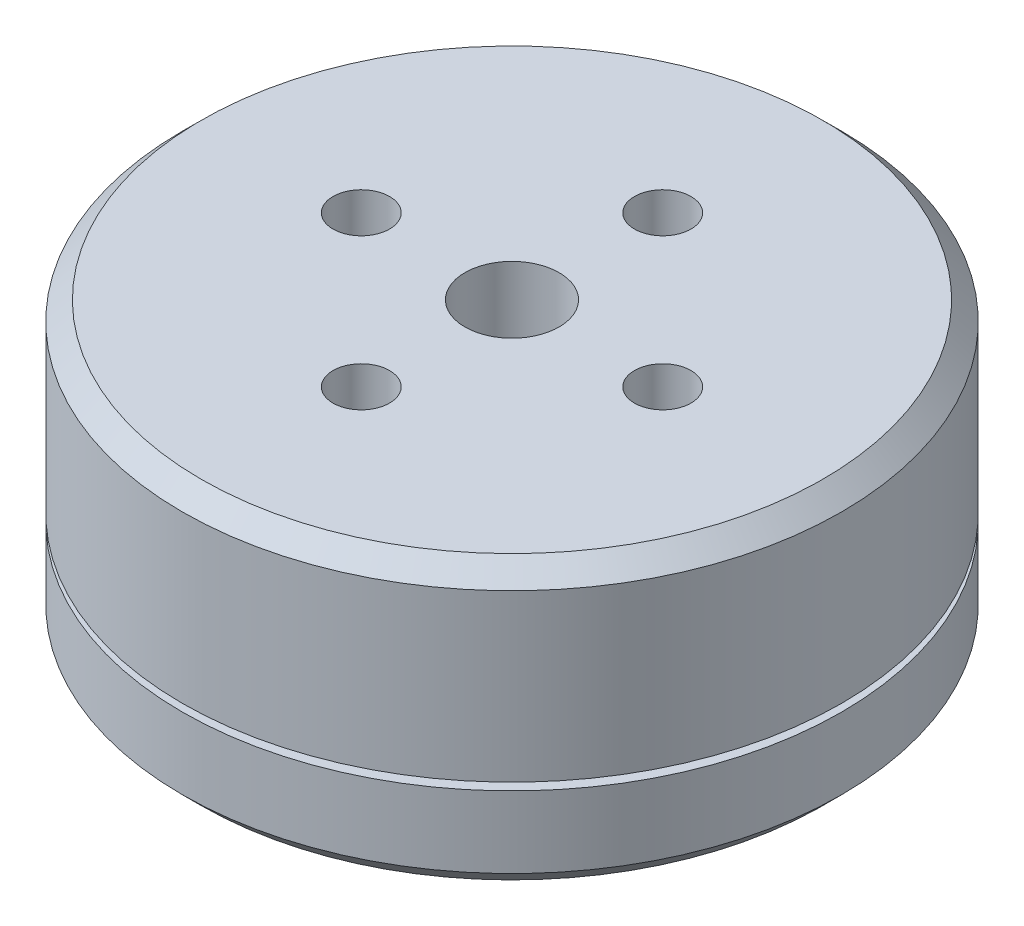
ISO-10303-21;
HEADER;
FILE_DESCRIPTION(('STEP AP214'),'2;1');
FILE_NAME('part.step','',(''),(''),'','','');
FILE_SCHEMA(('AUTOMOTIVE_DESIGN { 1 0 10303 214 1 1 1 1 }'));
ENDSEC;
DATA;
#1=APPLICATION_CONTEXT('core data for automotive mechanical design processes');
#2=APPLICATION_PROTOCOL_DEFINITION('international standard','automotive_design',2000,#1);
#3=PRODUCT_CONTEXT('',#1,'mechanical');
#4=PRODUCT('Part','Part','',(#3));
#5=PRODUCT_RELATED_PRODUCT_CATEGORY('part','',(#4));
#6=PRODUCT_DEFINITION_FORMATION('','',#4);
#7=PRODUCT_DEFINITION_CONTEXT('part definition',#1,'design');
#8=PRODUCT_DEFINITION('design','',#6,#7);
#9=PRODUCT_DEFINITION_SHAPE('','',#8);
#10=(LENGTH_UNIT() NAMED_UNIT(*) SI_UNIT(.MILLI.,.METRE.));
#11=(NAMED_UNIT(*) PLANE_ANGLE_UNIT() SI_UNIT($,.RADIAN.));
#12=(NAMED_UNIT(*) SI_UNIT($,.STERADIAN.) SOLID_ANGLE_UNIT());
#13=UNCERTAINTY_MEASURE_WITH_UNIT(LENGTH_MEASURE(1.E-05),#10,'distance_accuracy_value','');
#14=(GEOMETRIC_REPRESENTATION_CONTEXT(3) GLOBAL_UNCERTAINTY_ASSIGNED_CONTEXT((#13)) GLOBAL_UNIT_ASSIGNED_CONTEXT((#10,
#11,#12)) REPRESENTATION_CONTEXT('',''));
#15=CARTESIAN_POINT('',(0.,0.,0.));
#16=DIRECTION('',(0.,0.,1.));
#17=DIRECTION('',(1.,0.,0.));
#18=AXIS2_PLACEMENT_3D('',#15,#16,#17);
#19=CARTESIAN_POINT('',(0.,15.,0.));
#20=DIRECTION('',(0.,-1.,0.));
#21=DIRECTION('',(0.,0.,-1.));
#22=AXIS2_PLACEMENT_3D('',#19,#20,#21);
#23=CYLINDRICAL_SURFACE('',#22,17.5);
#24=CARTESIAN_POINT('',(0.,1.00000000000001,0.));
#25=DIRECTION('',(0.,1.,0.));
#26=DIRECTION('',(0.,0.,1.));
#27=AXIS2_PLACEMENT_3D('',#24,#25,#26);
#28=CIRCLE('',#27,17.5);
#29=CARTESIAN_POINT('',(0.,1.00000000000001,17.5));
#30=VERTEX_POINT('',#29);
#31=EDGE_CURVE('E61',#30,#30,#28,.T.);
#32=ORIENTED_EDGE('',*,*,#31,.T.);
#33=EDGE_LOOP('',(#32));
#34=FACE_BOUND('',#33,.T.);
#35=CARTESIAN_POINT('',(0.,4.8,0.));
#36=DIRECTION('',(0.,-1.,0.));
#37=DIRECTION('',(0.,0.,-1.));
#38=AXIS2_PLACEMENT_3D('',#35,#36,#37);
#39=CIRCLE('',#38,17.5);
#40=CARTESIAN_POINT('',(0.,4.8,-17.5));
#41=VERTEX_POINT('',#40);
#42=EDGE_CURVE('E105',#41,#41,#39,.T.);
#43=ORIENTED_EDGE('',*,*,#42,.T.);
#44=EDGE_LOOP('',(#43));
#45=FACE_BOUND('',#44,.T.);
#46=ADVANCED_FACE('F42',(#34,#45),#23,.T.);
#47=CARTESIAN_POINT('',(0.,0.,0.));
#48=DIRECTION('',(0.,1.,0.));
#49=DIRECTION('',(0.,0.,1.));
#50=AXIS2_PLACEMENT_3D('',#47,#48,#49);
#51=PLANE('',#50);
#52=CARTESIAN_POINT('',(0.,0.,0.));
#53=DIRECTION('',(0.,1.,0.));
#54=DIRECTION('',(0.,0.,1.));
#55=AXIS2_PLACEMENT_3D('',#52,#53,#54);
#56=CIRCLE('',#55,2.5);
#57=CARTESIAN_POINT('',(0.,0.,2.5));
#58=VERTEX_POINT('',#57);
#59=EDGE_CURVE('E147',#58,#58,#56,.T.);
#60=ORIENTED_EDGE('',*,*,#59,.T.);
#61=EDGE_LOOP('',(#60));
#62=FACE_BOUND('',#61,.T.);
#63=CARTESIAN_POINT('',(0.,0.,0.));
#64=DIRECTION('',(0.,1.,0.));
#65=DIRECTION('',(0.,0.,1.));
#66=AXIS2_PLACEMENT_3D('',#63,#64,#65);
#67=CIRCLE('',#66,16.5);
#68=CARTESIAN_POINT('',(0.,0.,16.5));
#69=VERTEX_POINT('',#68);
#70=EDGE_CURVE('E56',#69,#69,#67,.F.);
#71=ORIENTED_EDGE('',*,*,#70,.T.);
#72=EDGE_LOOP('',(#71));
#73=FACE_BOUND('',#72,.T.);
#74=CARTESIAN_POINT('',(0.,0.,9.5));
#75=DIRECTION('',(0.,-1.,0.));
#76=DIRECTION('',(0.,0.,-1.));
#77=AXIS2_PLACEMENT_3D('',#74,#75,#76);
#78=CIRCLE('',#77,1.5);
#79=CARTESIAN_POINT('',(0.,0.,8.));
#80=VERTEX_POINT('',#79);
#81=EDGE_CURVE('E125',#80,#80,#78,.T.);
#82=ORIENTED_EDGE('',*,*,#81,.F.);
#83=EDGE_LOOP('',(#82));
#84=FACE_BOUND('',#83,.T.);
#85=CARTESIAN_POINT('',(0.,0.,-9.5));
#86=DIRECTION('',(0.,-1.,0.));
#87=DIRECTION('',(0.,0.,-1.));
#88=AXIS2_PLACEMENT_3D('',#85,#86,#87);
#89=CIRCLE('',#88,1.5);
#90=CARTESIAN_POINT('',(0.,0.,-11.));
#91=VERTEX_POINT('',#90);
#92=EDGE_CURVE('E121',#91,#91,#89,.T.);
#93=ORIENTED_EDGE('',*,*,#92,.F.);
#94=EDGE_LOOP('',(#93));
#95=FACE_BOUND('',#94,.T.);
#96=CARTESIAN_POINT('',(8.,0.,0.));
#97=DIRECTION('',(0.,-1.,0.));
#98=DIRECTION('',(0.,0.,-1.));
#99=AXIS2_PLACEMENT_3D('',#96,#97,#98);
#100=CIRCLE('',#99,1.5);
#101=CARTESIAN_POINT('',(8.,0.,-1.5));
#102=VERTEX_POINT('',#101);
#103=EDGE_CURVE('E113',#102,#102,#100,.T.);
#104=ORIENTED_EDGE('',*,*,#103,.F.);
#105=EDGE_LOOP('',(#104));
#106=FACE_BOUND('',#105,.T.);
#107=CARTESIAN_POINT('',(-8.,0.,0.));
#108=DIRECTION('',(0.,-1.,0.));
#109=DIRECTION('',(0.,0.,-1.));
#110=AXIS2_PLACEMENT_3D('',#107,#108,#109);
#111=CIRCLE('',#110,1.5);
#112=CARTESIAN_POINT('',(-8.,0.,-1.5));
#113=VERTEX_POINT('',#112);
#114=EDGE_CURVE('E104',#113,#113,#111,.T.);
#115=ORIENTED_EDGE('',*,*,#114,.F.);
#116=EDGE_LOOP('',(#115));
#117=FACE_BOUND('',#116,.T.);
#118=ADVANCED_FACE('F156',(#62,#73,#84,#95,#106,#117),#51,.F.);
#119=CARTESIAN_POINT('',(-8.,3.,0.));
#120=DIRECTION('',(0.,-1.,0.));
#121=DIRECTION('',(0.,0.,-1.));
#122=AXIS2_PLACEMENT_3D('',#119,#120,#121);
#123=CYLINDRICAL_SURFACE('',#122,1.5);
#124=CARTESIAN_POINT('',(-8.,3.,0.));
#125=DIRECTION('',(0.,-1.,0.));
#126=DIRECTION('',(0.,0.,-1.));
#127=AXIS2_PLACEMENT_3D('',#124,#125,#126);
#128=CIRCLE('',#127,1.5);
#129=CARTESIAN_POINT('',(-8.,3.,-1.5));
#130=VERTEX_POINT('',#129);
#131=EDGE_CURVE('E100',#130,#130,#128,.T.);
#132=ORIENTED_EDGE('',*,*,#131,.F.);
#133=EDGE_LOOP('',(#132));
#134=FACE_BOUND('',#133,.T.);
#135=ORIENTED_EDGE('',*,*,#114,.T.);
#136=EDGE_LOOP('',(#135));
#137=FACE_BOUND('',#136,.T.);
#138=ADVANCED_FACE('F205',(#134,#137),#123,.F.);
#139=CARTESIAN_POINT('',(-8.,3.,0.));
#140=DIRECTION('',(0.,-1.,0.));
#141=DIRECTION('',(0.,0.,-1.));
#142=AXIS2_PLACEMENT_3D('',#139,#140,#141);
#143=PLANE('',#142);
#144=ORIENTED_EDGE('',*,*,#131,.T.);
#145=EDGE_LOOP('',(#144));
#146=FACE_BOUND('',#145,.T.);
#147=ADVANCED_FACE('F258',(#146),#143,.T.);
#148=CARTESIAN_POINT('',(8.,3.,0.));
#149=DIRECTION('',(0.,-1.,0.));
#150=DIRECTION('',(0.,0.,-1.));
#151=AXIS2_PLACEMENT_3D('',#148,#149,#150);
#152=CYLINDRICAL_SURFACE('',#151,1.5);
#153=CARTESIAN_POINT('',(8.,3.,0.));
#154=DIRECTION('',(0.,-1.,0.));
#155=DIRECTION('',(0.,0.,-1.));
#156=AXIS2_PLACEMENT_3D('',#153,#154,#155);
#157=CIRCLE('',#156,1.5);
#158=CARTESIAN_POINT('',(8.,3.,-1.5));
#159=VERTEX_POINT('',#158);
#160=EDGE_CURVE('E109',#159,#159,#157,.T.);
#161=ORIENTED_EDGE('',*,*,#160,.F.);
#162=EDGE_LOOP('',(#161));
#163=FACE_BOUND('',#162,.T.);
#164=ORIENTED_EDGE('',*,*,#103,.T.);
#165=EDGE_LOOP('',(#164));
#166=FACE_BOUND('',#165,.T.);
#167=ADVANCED_FACE('F255',(#163,#166),#152,.F.);
#168=CARTESIAN_POINT('',(8.,3.,0.));
#169=DIRECTION('',(0.,-1.,0.));
#170=DIRECTION('',(0.,0.,-1.));
#171=AXIS2_PLACEMENT_3D('',#168,#169,#170);
#172=PLANE('',#171);
#173=ORIENTED_EDGE('',*,*,#160,.T.);
#174=EDGE_LOOP('',(#173));
#175=FACE_BOUND('',#174,.T.);
#176=ADVANCED_FACE('F250',(#175),#172,.T.);
#177=CARTESIAN_POINT('',(0.,3.,-9.5));
#178=DIRECTION('',(0.,-1.,0.));
#179=DIRECTION('',(0.,0.,-1.));
#180=AXIS2_PLACEMENT_3D('',#177,#178,#179);
#181=CYLINDRICAL_SURFACE('',#180,1.5);
#182=CARTESIAN_POINT('',(0.,3.,-9.5));
#183=DIRECTION('',(0.,-1.,0.));
#184=DIRECTION('',(0.,0.,-1.));
#185=AXIS2_PLACEMENT_3D('',#182,#183,#184);
#186=CIRCLE('',#185,1.5);
#187=CARTESIAN_POINT('',(0.,3.,-11.));
#188=VERTEX_POINT('',#187);
#189=EDGE_CURVE('E117',#188,#188,#186,.T.);
#190=ORIENTED_EDGE('',*,*,#189,.F.);
#191=EDGE_LOOP('',(#190));
#192=FACE_BOUND('',#191,.T.);
#193=ORIENTED_EDGE('',*,*,#92,.T.);
#194=EDGE_LOOP('',(#193));
#195=FACE_BOUND('',#194,.T.);
#196=ADVANCED_FACE('F247',(#192,#195),#181,.F.);
#197=CARTESIAN_POINT('',(0.,3.,-9.5));
#198=DIRECTION('',(0.,-1.,0.));
#199=DIRECTION('',(0.,0.,-1.));
#200=AXIS2_PLACEMENT_3D('',#197,#198,#199);
#201=PLANE('',#200);
#202=ORIENTED_EDGE('',*,*,#189,.T.);
#203=EDGE_LOOP('',(#202));
#204=FACE_BOUND('',#203,.T.);
#205=ADVANCED_FACE('F245',(#204),#201,.T.);
#206=CARTESIAN_POINT('',(0.,3.,9.5));
#207=DIRECTION('',(0.,-1.,0.));
#208=DIRECTION('',(0.,0.,-1.));
#209=AXIS2_PLACEMENT_3D('',#206,#207,#208);
#210=CYLINDRICAL_SURFACE('',#209,1.5);
#211=CARTESIAN_POINT('',(0.,3.,9.5));
#212=DIRECTION('',(0.,-1.,0.));
#213=DIRECTION('',(0.,0.,-1.));
#214=AXIS2_PLACEMENT_3D('',#211,#212,#213);
#215=CIRCLE('',#214,1.5);
#216=CARTESIAN_POINT('',(0.,3.,8.));
#217=VERTEX_POINT('',#216);
#218=EDGE_CURVE('E73',#217,#217,#215,.T.);
#219=ORIENTED_EDGE('',*,*,#218,.F.);
#220=EDGE_LOOP('',(#219));
#221=FACE_BOUND('',#220,.T.);
#222=ORIENTED_EDGE('',*,*,#81,.T.);
#223=EDGE_LOOP('',(#222));
#224=FACE_BOUND('',#223,.T.);
#225=ADVANCED_FACE('F241',(#221,#224),#210,.F.);
#226=CARTESIAN_POINT('',(0.,3.,9.5));
#227=DIRECTION('',(0.,-1.,0.));
#228=DIRECTION('',(0.,0.,-1.));
#229=AXIS2_PLACEMENT_3D('',#226,#227,#228);
#230=PLANE('',#229);
#231=ORIENTED_EDGE('',*,*,#218,.T.);
#232=EDGE_LOOP('',(#231));
#233=FACE_BOUND('',#232,.T.);
#234=ADVANCED_FACE('F237',(#233),#230,.T.);
#235=CARTESIAN_POINT('',(0.,4.8,0.));
#236=DIRECTION('',(0.,-1.,0.));
#237=DIRECTION('',(0.,0.,-1.));
#238=AXIS2_PLACEMENT_3D('',#235,#236,#237);
#239=PLANE('',#238);
#240=ORIENTED_EDGE('',*,*,#42,.F.);
#241=EDGE_LOOP('',(#240));
#242=FACE_BOUND('',#241,.T.);
#243=CARTESIAN_POINT('',(0.,4.8,0.));
#244=DIRECTION('',(0.,-1.,0.));
#245=DIRECTION('',(0.,0.,-1.));
#246=AXIS2_PLACEMENT_3D('',#243,#244,#245);
#247=CIRCLE('',#246,16.5);
#248=CARTESIAN_POINT('',(0.,4.8,-16.5));
#249=VERTEX_POINT('',#248);
#250=EDGE_CURVE('E135',#249,#249,#247,.T.);
#251=ORIENTED_EDGE('',*,*,#250,.T.);
#252=EDGE_LOOP('',(#251));
#253=FACE_BOUND('',#252,.T.);
#254=ADVANCED_FACE('F230',(#242,#253),#239,.F.);
#255=CARTESIAN_POINT('',(0.,4.8,0.));
#256=DIRECTION('',(0.,1.,0.));
#257=DIRECTION('',(0.,0.,1.));
#258=AXIS2_PLACEMENT_3D('',#255,#256,#257);
#259=CYLINDRICAL_SURFACE('',#258,16.5);
#260=ORIENTED_EDGE('',*,*,#250,.F.);
#261=EDGE_LOOP('',(#260));
#262=FACE_BOUND('',#261,.T.);
#263=CARTESIAN_POINT('',(0.,5.2,0.));
#264=DIRECTION('',(0.,-1.,0.));
#265=DIRECTION('',(0.,0.,-1.));
#266=AXIS2_PLACEMENT_3D('',#263,#264,#265);
#267=CIRCLE('',#266,16.5);
#268=CARTESIAN_POINT('',(0.,5.2,-16.5));
#269=VERTEX_POINT('',#268);
#270=EDGE_CURVE('E143',#269,#269,#267,.T.);
#271=ORIENTED_EDGE('',*,*,#270,.T.);
#272=EDGE_LOOP('',(#271));
#273=FACE_BOUND('',#272,.T.);
#274=ADVANCED_FACE('F221',(#262,#273),#259,.T.);
#275=CARTESIAN_POINT('',(0.,5.2,0.));
#276=DIRECTION('',(0.,-1.,0.));
#277=DIRECTION('',(0.,0.,-1.));
#278=AXIS2_PLACEMENT_3D('',#275,#276,#277);
#279=PLANE('',#278);
#280=ORIENTED_EDGE('',*,*,#270,.F.);
#281=EDGE_LOOP('',(#280));
#282=FACE_BOUND('',#281,.T.);
#283=CARTESIAN_POINT('',(0.,5.2,0.));
#284=DIRECTION('',(0.,-1.,0.));
#285=DIRECTION('',(0.,0.,-1.));
#286=AXIS2_PLACEMENT_3D('',#283,#284,#285);
#287=CIRCLE('',#286,17.5);
#288=CARTESIAN_POINT('',(0.,5.2,-17.5));
#289=VERTEX_POINT('',#288);
#290=EDGE_CURVE('E139',#289,#289,#287,.T.);
#291=ORIENTED_EDGE('',*,*,#290,.T.);
#292=EDGE_LOOP('',(#291));
#293=FACE_BOUND('',#292,.T.);
#294=ADVANCED_FACE('F218',(#282,#293),#279,.T.);
#295=CARTESIAN_POINT('',(0.,12.,8.));
#296=DIRECTION('',(0.,1.,0.));
#297=DIRECTION('',(0.,0.,1.));
#298=AXIS2_PLACEMENT_3D('',#295,#296,#297);
#299=PLANE('',#298);
#300=CARTESIAN_POINT('',(0.,12.,8.));
#301=DIRECTION('',(0.,1.,0.));
#302=DIRECTION('',(0.,0.,1.));
#303=AXIS2_PLACEMENT_3D('',#300,#301,#302);
#304=CIRCLE('',#303,1.5);
#305=CARTESIAN_POINT('',(0.,12.,9.5));
#306=VERTEX_POINT('',#305);
#307=EDGE_CURVE('E68',#306,#306,#304,.T.);
#308=ORIENTED_EDGE('',*,*,#307,.T.);
#309=EDGE_LOOP('',(#308));
#310=FACE_BOUND('',#309,.T.);
#311=ADVANCED_FACE('F220',(#310),#299,.T.);
#312=CARTESIAN_POINT('',(0.,12.,-8.));
#313=DIRECTION('',(0.,1.,0.));
#314=DIRECTION('',(0.,0.,1.));
#315=AXIS2_PLACEMENT_3D('',#312,#313,#314);
#316=PLANE('',#315);
#317=CARTESIAN_POINT('',(0.,12.,-8.));
#318=DIRECTION('',(0.,1.,0.));
#319=DIRECTION('',(0.,0.,1.));
#320=AXIS2_PLACEMENT_3D('',#317,#318,#319);
#321=CIRCLE('',#320,1.5);
#322=CARTESIAN_POINT('',(0.,12.,-6.5));
#323=VERTEX_POINT('',#322);
#324=EDGE_CURVE('E77',#323,#323,#321,.T.);
#325=ORIENTED_EDGE('',*,*,#324,.T.);
#326=EDGE_LOOP('',(#325));
#327=FACE_BOUND('',#326,.T.);
#328=ADVANCED_FACE('F228',(#327),#316,.T.);
#329=CARTESIAN_POINT('',(8.,12.,0.));
#330=DIRECTION('',(0.,1.,0.));
#331=DIRECTION('',(0.,0.,1.));
#332=AXIS2_PLACEMENT_3D('',#329,#330,#331);
#333=PLANE('',#332);
#334=CARTESIAN_POINT('',(8.,12.,0.));
#335=DIRECTION('',(0.,1.,0.));
#336=DIRECTION('',(0.,0.,1.));
#337=AXIS2_PLACEMENT_3D('',#334,#335,#336);
#338=CIRCLE('',#337,1.5);
#339=CARTESIAN_POINT('',(8.,12.,1.5));
#340=VERTEX_POINT('',#339);
#341=EDGE_CURVE('E85',#340,#340,#338,.T.);
#342=ORIENTED_EDGE('',*,*,#341,.T.);
#343=EDGE_LOOP('',(#342));
#344=FACE_BOUND('',#343,.T.);
#345=ADVANCED_FACE('F192',(#344),#333,.T.);
#346=CARTESIAN_POINT('',(-8.,12.,0.));
#347=DIRECTION('',(0.,1.,0.));
#348=DIRECTION('',(0.,0.,1.));
#349=AXIS2_PLACEMENT_3D('',#346,#347,#348);
#350=PLANE('',#349);
#351=CARTESIAN_POINT('',(-8.,12.,0.));
#352=DIRECTION('',(0.,1.,0.));
#353=DIRECTION('',(0.,0.,1.));
#354=AXIS2_PLACEMENT_3D('',#351,#352,#353);
#355=CIRCLE('',#354,1.5);
#356=CARTESIAN_POINT('',(-8.,12.,1.5));
#357=VERTEX_POINT('',#356);
#358=EDGE_CURVE('E67',#357,#357,#355,.T.);
#359=ORIENTED_EDGE('',*,*,#358,.T.);
#360=EDGE_LOOP('',(#359));
#361=FACE_BOUND('',#360,.T.);
#362=ADVANCED_FACE('F182',(#361),#350,.T.);
#363=CARTESIAN_POINT('',(0.,12.,8.));
#364=DIRECTION('',(0.,1.,0.));
#365=DIRECTION('',(0.,0.,1.));
#366=AXIS2_PLACEMENT_3D('',#363,#364,#365);
#367=CYLINDRICAL_SURFACE('',#366,1.5);
#368=ORIENTED_EDGE('',*,*,#307,.F.);
#369=EDGE_LOOP('',(#368));
#370=FACE_BOUND('',#369,.T.);
#371=CARTESIAN_POINT('',(0.,15.,8.));
#372=DIRECTION('',(0.,1.,0.));
#373=DIRECTION('',(0.,0.,1.));
#374=AXIS2_PLACEMENT_3D('',#371,#372,#373);
#375=CIRCLE('',#374,1.5);
#376=CARTESIAN_POINT('',(0.,15.,9.5));
#377=VERTEX_POINT('',#376);
#378=EDGE_CURVE('E72',#377,#377,#375,.T.);
#379=ORIENTED_EDGE('',*,*,#378,.T.);
#380=EDGE_LOOP('',(#379));
#381=FACE_BOUND('',#380,.T.);
#382=ADVANCED_FACE('F179',(#370,#381),#367,.F.);
#383=CARTESIAN_POINT('',(0.,12.,-8.));
#384=DIRECTION('',(0.,1.,0.));
#385=DIRECTION('',(0.,0.,1.));
#386=AXIS2_PLACEMENT_3D('',#383,#384,#385);
#387=CYLINDRICAL_SURFACE('',#386,1.5);
#388=ORIENTED_EDGE('',*,*,#324,.F.);
#389=EDGE_LOOP('',(#388));
#390=FACE_BOUND('',#389,.T.);
#391=CARTESIAN_POINT('',(0.,15.,-8.));
#392=DIRECTION('',(0.,1.,0.));
#393=DIRECTION('',(0.,0.,1.));
#394=AXIS2_PLACEMENT_3D('',#391,#392,#393);
#395=CIRCLE('',#394,1.5);
#396=CARTESIAN_POINT('',(0.,15.,-6.5));
#397=VERTEX_POINT('',#396);
#398=EDGE_CURVE('E81',#397,#397,#395,.T.);
#399=ORIENTED_EDGE('',*,*,#398,.T.);
#400=EDGE_LOOP('',(#399));
#401=FACE_BOUND('',#400,.T.);
#402=ADVANCED_FACE('F181',(#390,#401),#387,.F.);
#403=CARTESIAN_POINT('',(8.,12.,0.));
#404=DIRECTION('',(0.,1.,0.));
#405=DIRECTION('',(0.,0.,1.));
#406=AXIS2_PLACEMENT_3D('',#403,#404,#405);
#407=CYLINDRICAL_SURFACE('',#406,1.5);
#408=ORIENTED_EDGE('',*,*,#341,.F.);
#409=EDGE_LOOP('',(#408));
#410=FACE_BOUND('',#409,.T.);
#411=CARTESIAN_POINT('',(8.,15.,0.));
#412=DIRECTION('',(0.,1.,0.));
#413=DIRECTION('',(0.,0.,1.));
#414=AXIS2_PLACEMENT_3D('',#411,#412,#413);
#415=CIRCLE('',#414,1.5);
#416=CARTESIAN_POINT('',(8.,15.,1.5));
#417=VERTEX_POINT('',#416);
#418=EDGE_CURVE('E89',#417,#417,#415,.T.);
#419=ORIENTED_EDGE('',*,*,#418,.T.);
#420=EDGE_LOOP('',(#419));
#421=FACE_BOUND('',#420,.T.);
#422=ADVANCED_FACE('F189',(#410,#421),#407,.F.);
#423=CARTESIAN_POINT('',(-8.,12.,0.));
#424=DIRECTION('',(0.,1.,0.));
#425=DIRECTION('',(0.,0.,1.));
#426=AXIS2_PLACEMENT_3D('',#423,#424,#425);
#427=CYLINDRICAL_SURFACE('',#426,1.5);
#428=ORIENTED_EDGE('',*,*,#358,.F.);
#429=EDGE_LOOP('',(#428));
#430=FACE_BOUND('',#429,.T.);
#431=CARTESIAN_POINT('',(-8.,15.,0.));
#432=DIRECTION('',(0.,1.,0.));
#433=DIRECTION('',(0.,0.,1.));
#434=AXIS2_PLACEMENT_3D('',#431,#432,#433);
#435=CIRCLE('',#434,1.5);
#436=CARTESIAN_POINT('',(-8.,15.,1.5));
#437=VERTEX_POINT('',#436);
#438=EDGE_CURVE('E93',#437,#437,#435,.T.);
#439=ORIENTED_EDGE('',*,*,#438,.T.);
#440=EDGE_LOOP('',(#439));
#441=FACE_BOUND('',#440,.T.);
#442=ADVANCED_FACE('F168',(#430,#441),#427,.F.);
#443=CARTESIAN_POINT('',(0.,15.,0.));
#444=DIRECTION('',(0.,1.,0.));
#445=DIRECTION('',(0.,0.,1.));
#446=AXIS2_PLACEMENT_3D('',#443,#444,#445);
#447=PLANE('',#446);
#448=CARTESIAN_POINT('',(0.,15.,0.));
#449=DIRECTION('',(0.,1.,0.));
#450=DIRECTION('',(0.,0.,1.));
#451=AXIS2_PLACEMENT_3D('',#448,#449,#450);
#452=CIRCLE('',#451,2.5);
#453=CARTESIAN_POINT('',(0.,15.,2.5));
#454=VERTEX_POINT('',#453);
#455=EDGE_CURVE('E148',#454,#454,#452,.T.);
#456=ORIENTED_EDGE('',*,*,#455,.F.);
#457=EDGE_LOOP('',(#456));
#458=FACE_BOUND('',#457,.T.);
#459=CARTESIAN_POINT('',(0.,15.,0.));
#460=DIRECTION('',(0.,1.,0.));
#461=DIRECTION('',(0.,0.,1.));
#462=AXIS2_PLACEMENT_3D('',#459,#460,#461);
#463=CIRCLE('',#462,16.5);
#464=CARTESIAN_POINT('',(0.,15.,16.5));
#465=VERTEX_POINT('',#464);
#466=EDGE_CURVE('E51',#465,#465,#463,.T.);
#467=ORIENTED_EDGE('',*,*,#466,.T.);
#468=EDGE_LOOP('',(#467));
#469=FACE_BOUND('',#468,.T.);
#470=ORIENTED_EDGE('',*,*,#438,.F.);
#471=EDGE_LOOP('',(#470));
#472=FACE_BOUND('',#471,.T.);
#473=ORIENTED_EDGE('',*,*,#418,.F.);
#474=EDGE_LOOP('',(#473));
#475=FACE_BOUND('',#474,.T.);
#476=ORIENTED_EDGE('',*,*,#398,.F.);
#477=EDGE_LOOP('',(#476));
#478=FACE_BOUND('',#477,.T.);
#479=ORIENTED_EDGE('',*,*,#378,.F.);
#480=EDGE_LOOP('',(#479));
#481=FACE_BOUND('',#480,.T.);
#482=ADVANCED_FACE('F165',(#458,#469,#472,#475,#478,#481),#447,.T.);
#483=CARTESIAN_POINT('',(0.,14.,0.));
#484=DIRECTION('',(0.,1.,0.));
#485=DIRECTION('',(0.,0.,1.));
#486=AXIS2_PLACEMENT_3D('',#483,#484,#485);
#487=CIRCLE('',#486,17.5);
#488=CARTESIAN_POINT('',(0.,14.,17.5));
#489=VERTEX_POINT('',#488);
#490=EDGE_CURVE('E10',#489,#489,#487,.F.);
#491=ORIENTED_EDGE('',*,*,#490,.T.);
#492=EDGE_LOOP('',(#491));
#493=FACE_BOUND('',#492,.T.);
#494=ORIENTED_EDGE('',*,*,#290,.F.);
#495=EDGE_LOOP('',(#494));
#496=FACE_BOUND('',#495,.T.);
#497=ADVANCED_FACE('F167',(#493,#496),#23,.T.);
#498=CARTESIAN_POINT('',(0.,1.00000000000001,0.));
#499=DIRECTION('',(0.,1.,0.));
#500=DIRECTION('',(0.,0.,1.));
#501=AXIS2_PLACEMENT_3D('',#498,#499,#500);
#502=CONICAL_SURFACE('',#501,17.5,0.785398163397452);
#503=ORIENTED_EDGE('',*,*,#70,.F.);
#504=EDGE_LOOP('',(#503));
#505=FACE_BOUND('',#504,.T.);
#506=ORIENTED_EDGE('',*,*,#31,.F.);
#507=EDGE_LOOP('',(#506));
#508=FACE_BOUND('',#507,.T.);
#509=ADVANCED_FACE('F209',(#505,#508),#502,.T.);
#510=CARTESIAN_POINT('',(0.,15.,0.));
#511=DIRECTION('',(0.,-1.,0.));
#512=DIRECTION('',(0.,0.,-1.));
#513=AXIS2_PLACEMENT_3D('',#510,#511,#512);
#514=CONICAL_SURFACE('',#513,16.5,0.785398163397445);
#515=ORIENTED_EDGE('',*,*,#490,.F.);
#516=EDGE_LOOP('',(#515));
#517=FACE_BOUND('',#516,.T.);
#518=ORIENTED_EDGE('',*,*,#466,.F.);
#519=EDGE_LOOP('',(#518));
#520=FACE_BOUND('',#519,.T.);
#521=ADVANCED_FACE('F45',(#517,#520),#514,.T.);
#522=CARTESIAN_POINT('',(0.,0.,0.));
#523=DIRECTION('',(0.,1.,0.));
#524=DIRECTION('',(0.,0.,1.));
#525=AXIS2_PLACEMENT_3D('',#522,#523,#524);
#526=CYLINDRICAL_SURFACE('',#525,2.5);
#527=ORIENTED_EDGE('',*,*,#59,.F.);
#528=EDGE_LOOP('',(#527));
#529=FACE_BOUND('',#528,.T.);
#530=ORIENTED_EDGE('',*,*,#455,.T.);
#531=EDGE_LOOP('',(#530));
#532=FACE_BOUND('',#531,.T.);
#533=ADVANCED_FACE('F159',(#529,#532),#526,.F.);
#534=CLOSED_SHELL('',(#46,#118,#138,#147,#167,#176,#196,#205,#225,#234,#254,#274,#294,#311,#328,
#345,#362,#382,#402,#422,#442,#482,#497,#509,#521,#533));
#535=MANIFOLD_SOLID_BREP('B2',#534);
#536=ADVANCED_BREP_SHAPE_REPRESENTATION('',(#18,#535),#14);
#537=SHAPE_DEFINITION_REPRESENTATION(#9,#536);
ENDSEC;
END-ISO-10303-21;
